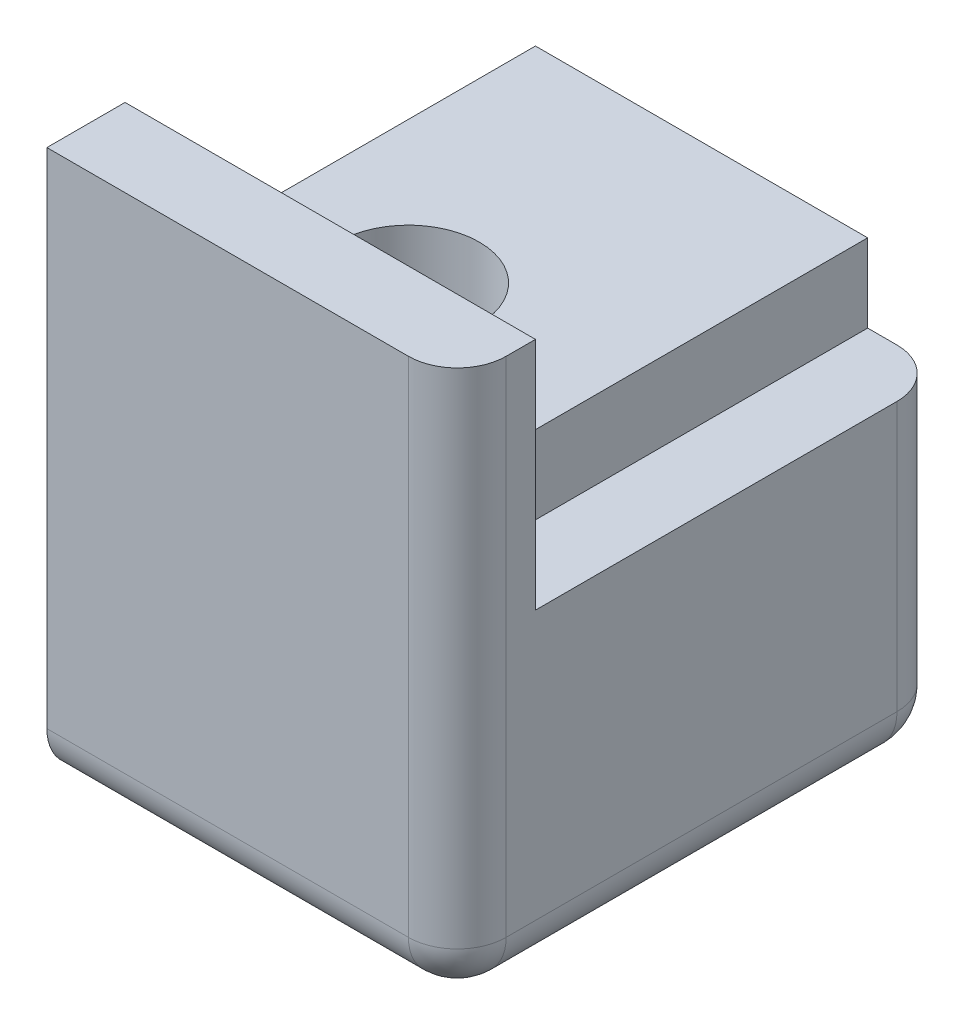
ISO-10303-21;
HEADER;
FILE_DESCRIPTION(('STEP AP214'),'2;1');
FILE_NAME('part.step','',(''),(''),'','','');
FILE_SCHEMA(('AUTOMOTIVE_DESIGN { 1 0 10303 214 1 1 1 1 }'));
ENDSEC;
DATA;
#1=APPLICATION_CONTEXT('core data for automotive mechanical design processes');
#2=APPLICATION_PROTOCOL_DEFINITION('international standard','automotive_design',2000,#1);
#3=PRODUCT_CONTEXT('',#1,'mechanical');
#4=PRODUCT('Part','Part','',(#3));
#5=PRODUCT_RELATED_PRODUCT_CATEGORY('part','',(#4));
#6=PRODUCT_DEFINITION_FORMATION('','',#4);
#7=PRODUCT_DEFINITION_CONTEXT('part definition',#1,'design');
#8=PRODUCT_DEFINITION('design','',#6,#7);
#9=PRODUCT_DEFINITION_SHAPE('','',#8);
#10=(LENGTH_UNIT() NAMED_UNIT(*) SI_UNIT(.MILLI.,.METRE.));
#11=(NAMED_UNIT(*) PLANE_ANGLE_UNIT() SI_UNIT($,.RADIAN.));
#12=(NAMED_UNIT(*) SI_UNIT($,.STERADIAN.) SOLID_ANGLE_UNIT());
#13=UNCERTAINTY_MEASURE_WITH_UNIT(LENGTH_MEASURE(1.E-05),#10,'distance_accuracy_value','');
#14=(GEOMETRIC_REPRESENTATION_CONTEXT(3) GLOBAL_UNCERTAINTY_ASSIGNED_CONTEXT((#13)) GLOBAL_UNIT_ASSIGNED_CONTEXT((#10,
#11,#12)) REPRESENTATION_CONTEXT('',''));
#15=CARTESIAN_POINT('',(0.,0.,0.));
#16=DIRECTION('',(0.,0.,1.));
#17=DIRECTION('',(1.,0.,0.));
#18=AXIS2_PLACEMENT_3D('',#15,#16,#17);
#19=CARTESIAN_POINT('',(-7.1,11.3,3.4));
#20=DIRECTION('',(0.,0.,1.));
#21=DIRECTION('',(0.,-1.,0.));
#22=AXIS2_PLACEMENT_3D('',#19,#20,#21);
#23=PLANE('',#22);
#24=DIRECTION('',(0.,1.,0.));
#25=VECTOR('',#24,1.);
#26=CARTESIAN_POINT('',(2.6,9.8,3.4));
#27=LINE('',#26,#25);
#28=CARTESIAN_POINT('',(2.6,6.5,3.4));
#29=VERTEX_POINT('',#28);
#30=CARTESIAN_POINT('',(2.6,8.1,3.4));
#31=VERTEX_POINT('',#30);
#32=EDGE_CURVE('E151',#29,#31,#27,.T.);
#33=ORIENTED_EDGE('',*,*,#32,.T.);
#34=DIRECTION('',(1.,0.,0.));
#35=VECTOR('',#34,1.);
#36=CARTESIAN_POINT('',(-4.2,8.1,3.4));
#37=LINE('',#36,#35);
#38=CARTESIAN_POINT('',(-4.2,8.1,3.4));
#39=VERTEX_POINT('',#38);
#40=EDGE_CURVE('E129',#39,#31,#37,.T.);
#41=ORIENTED_EDGE('',*,*,#40,.F.);
#42=DIRECTION('',(0.,-1.,0.));
#43=VECTOR('',#42,1.);
#44=CARTESIAN_POINT('',(-4.20000000000001,11.3,3.4));
#45=LINE('',#44,#43);
#46=CARTESIAN_POINT('',(-4.20000000000001,11.3,3.4));
#47=VERTEX_POINT('',#46);
#48=EDGE_CURVE('E139',#47,#39,#45,.T.);
#49=ORIENTED_EDGE('',*,*,#48,.F.);
#50=DIRECTION('',(-1.,0.,0.));
#51=VECTOR('',#50,1.);
#52=CARTESIAN_POINT('',(0.,11.3,3.4));
#53=LINE('',#52,#51);
#54=CARTESIAN_POINT('',(4.2,11.3,3.4));
#55=VERTEX_POINT('',#54);
#56=EDGE_CURVE('E190',#55,#47,#53,.T.);
#57=ORIENTED_EDGE('',*,*,#56,.F.);
#58=DIRECTION('',(0.,-1.,0.));
#59=VECTOR('',#58,1.);
#60=CARTESIAN_POINT('',(4.2,11.3,3.4));
#61=LINE('',#60,#59);
#62=CARTESIAN_POINT('',(4.2,6.5,3.4));
#63=VERTEX_POINT('',#62);
#64=EDGE_CURVE('E147',#55,#63,#61,.T.);
#65=ORIENTED_EDGE('',*,*,#64,.T.);
#66=DIRECTION('',(-1.,0.,0.));
#67=VECTOR('',#66,1.);
#68=CARTESIAN_POINT('',(4.2,6.5,3.4));
#69=LINE('',#68,#67);
#70=EDGE_CURVE('E164',#63,#29,#69,.T.);
#71=ORIENTED_EDGE('',*,*,#70,.T.);
#72=EDGE_LOOP('',(#33,#41,#49,#57,#65,#71));
#73=FACE_BOUND('',#72,.T.);
#74=ADVANCED_FACE('F35',(#73),#23,.F.);
#75=CARTESIAN_POINT('',(-4.2,8.1,3.4));
#76=DIRECTION('',(0.,-1.,0.));
#77=DIRECTION('',(1.,0.,0.));
#78=AXIS2_PLACEMENT_3D('',#75,#76,#77);
#79=PLANE('',#78);
#80=DIRECTION('',(0.,0.,-1.));
#81=VECTOR('',#80,1.);
#82=CARTESIAN_POINT('',(-4.2,8.1,3.4));
#83=LINE('',#82,#81);
#84=CARTESIAN_POINT('',(-4.2,8.1,-5.));
#85=VERTEX_POINT('',#84);
#86=EDGE_CURVE('E124',#39,#85,#83,.T.);
#87=ORIENTED_EDGE('',*,*,#86,.F.);
#88=ORIENTED_EDGE('',*,*,#40,.T.);
#89=DIRECTION('',(0.,0.,-1.));
#90=VECTOR('',#89,1.);
#91=CARTESIAN_POINT('',(2.6,8.1,3.4));
#92=LINE('',#91,#90);
#93=CARTESIAN_POINT('',(2.6,8.1,-5.));
#94=VERTEX_POINT('',#93);
#95=EDGE_CURVE('E136',#31,#94,#92,.T.);
#96=ORIENTED_EDGE('',*,*,#95,.T.);
#97=DIRECTION('',(1.,0.,0.));
#98=VECTOR('',#97,1.);
#99=CARTESIAN_POINT('',(-4.2,8.1,-5.));
#100=LINE('',#99,#98);
#101=EDGE_CURVE('E132',#85,#94,#100,.T.);
#102=ORIENTED_EDGE('',*,*,#101,.F.);
#103=EDGE_LOOP('',(#87,#88,#96,#102));
#104=FACE_BOUND('',#103,.T.);
#105=CARTESIAN_POINT('',(-1.30000000000001,8.1,0.499999999999998));
#106=DIRECTION('',(0.,-1.,0.));
#107=DIRECTION('',(1.,0.,0.));
#108=AXIS2_PLACEMENT_3D('',#105,#106,#107);
#109=CIRCLE('',#108,1.44999999999999);
#110=CARTESIAN_POINT('',(0.149999999999987,8.1,0.499999999999998));
#111=VERTEX_POINT('',#110);
#112=EDGE_CURVE('E155',#111,#111,#109,.T.);
#113=ORIENTED_EDGE('',*,*,#112,.T.);
#114=EDGE_LOOP('',(#113));
#115=FACE_BOUND('',#114,.T.);
#116=ADVANCED_FACE('F126',(#104,#115),#79,.F.);
#117=CARTESIAN_POINT('',(4.2,11.3,5.));
#118=DIRECTION('',(-1.,0.,0.));
#119=DIRECTION('',(0.,0.,1.));
#120=AXIS2_PLACEMENT_3D('',#117,#118,#119);
#121=PLANE('',#120);
#122=DIRECTION('',(0.,0.,-1.));
#123=VECTOR('',#122,1.);
#124=CARTESIAN_POINT('',(4.2,11.3,5.));
#125=LINE('',#124,#123);
#126=CARTESIAN_POINT('',(4.2,11.3,4.));
#127=VERTEX_POINT('',#126);
#128=EDGE_CURVE('E177',#127,#55,#125,.T.);
#129=ORIENTED_EDGE('',*,*,#128,.F.);
#130=DIRECTION('',(0.,-1.,0.));
#131=VECTOR('',#130,1.);
#132=CARTESIAN_POINT('',(4.2,11.3,4.));
#133=LINE('',#132,#131);
#134=CARTESIAN_POINT('',(4.2,1.,4.));
#135=VERTEX_POINT('',#134);
#136=EDGE_CURVE('E211',#127,#135,#133,.T.);
#137=ORIENTED_EDGE('',*,*,#136,.T.);
#138=DIRECTION('',(0.,0.,-1.));
#139=VECTOR('',#138,1.);
#140=CARTESIAN_POINT('',(4.2,1.,-5.));
#141=LINE('',#140,#139);
#142=CARTESIAN_POINT('',(4.2,1.,-4.));
#143=VERTEX_POINT('',#142);
#144=EDGE_CURVE('E207',#135,#143,#141,.T.);
#145=ORIENTED_EDGE('',*,*,#144,.T.);
#146=DIRECTION('',(0.,-1.,0.));
#147=VECTOR('',#146,1.);
#148=CARTESIAN_POINT('',(4.2,11.3,-4.));
#149=LINE('',#148,#147);
#150=CARTESIAN_POINT('',(4.2,6.5,-4.));
#151=VERTEX_POINT('',#150);
#152=EDGE_CURVE('E209',#143,#151,#149,.F.);
#153=ORIENTED_EDGE('',*,*,#152,.T.);
#154=DIRECTION('',(0.,0.,-1.));
#155=VECTOR('',#154,1.);
#156=CARTESIAN_POINT('',(4.2,6.5,3.4));
#157=LINE('',#156,#155);
#158=EDGE_CURVE('E168',#63,#151,#157,.T.);
#159=ORIENTED_EDGE('',*,*,#158,.F.);
#160=ORIENTED_EDGE('',*,*,#64,.F.);
#161=EDGE_LOOP('',(#129,#137,#145,#153,#159,#160));
#162=FACE_BOUND('',#161,.T.);
#163=ADVANCED_FACE('F269',(#162),#121,.F.);
#164=CARTESIAN_POINT('',(-4.20000000000001,11.3,-5.));
#165=DIRECTION('',(0.,0.,1.));
#166=DIRECTION('',(1.,0.,0.));
#167=AXIS2_PLACEMENT_3D('',#164,#165,#166);
#168=PLANE('',#167);
#169=DIRECTION('',(-1.,0.,0.));
#170=VECTOR('',#169,1.);
#171=CARTESIAN_POINT('',(4.2,6.5,-5.));
#172=LINE('',#171,#170);
#173=CARTESIAN_POINT('',(3.2,6.5,-5.));
#174=VERTEX_POINT('',#173);
#175=CARTESIAN_POINT('',(2.6,6.5,-5.));
#176=VERTEX_POINT('',#175);
#177=EDGE_CURVE('E163',#174,#176,#172,.T.);
#178=ORIENTED_EDGE('',*,*,#177,.F.);
#179=DIRECTION('',(0.,-1.,0.));
#180=VECTOR('',#179,1.);
#181=CARTESIAN_POINT('',(3.2,11.3,-5.));
#182=LINE('',#181,#180);
#183=CARTESIAN_POINT('',(3.2,1.,-5.));
#184=VERTEX_POINT('',#183);
#185=EDGE_CURVE('E44',#174,#184,#182,.T.);
#186=ORIENTED_EDGE('',*,*,#185,.T.);
#187=DIRECTION('',(-1.,0.,0.));
#188=VECTOR('',#187,1.);
#189=CARTESIAN_POINT('',(-4.20000000000001,1.,-5.));
#190=LINE('',#189,#188);
#191=CARTESIAN_POINT('',(-4.20000000000001,1.,-5.));
#192=VERTEX_POINT('',#191);
#193=EDGE_CURVE('E215',#184,#192,#190,.T.);
#194=ORIENTED_EDGE('',*,*,#193,.T.);
#195=DIRECTION('',(0.,-1.,0.));
#196=VECTOR('',#195,1.);
#197=CARTESIAN_POINT('',(-4.20000000000001,11.3,-5.));
#198=LINE('',#197,#196);
#199=EDGE_CURVE('E188',#85,#192,#198,.T.);
#200=ORIENTED_EDGE('',*,*,#199,.F.);
#201=ORIENTED_EDGE('',*,*,#101,.T.);
#202=DIRECTION('',(0.,1.,0.));
#203=VECTOR('',#202,1.);
#204=CARTESIAN_POINT('',(2.6,9.8,-5.));
#205=LINE('',#204,#203);
#206=EDGE_CURVE('E166',#176,#94,#205,.T.);
#207=ORIENTED_EDGE('',*,*,#206,.F.);
#208=EDGE_LOOP('',(#178,#186,#194,#200,#201,#207));
#209=FACE_BOUND('',#208,.T.);
#210=ADVANCED_FACE('F251',(#209),#168,.F.);
#211=CARTESIAN_POINT('',(-4.20000000000001,11.3,5.));
#212=DIRECTION('',(1.,0.,0.));
#213=DIRECTION('',(0.,0.,-1.));
#214=AXIS2_PLACEMENT_3D('',#211,#212,#213);
#215=PLANE('',#214);
#216=ORIENTED_EDGE('',*,*,#48,.T.);
#217=ORIENTED_EDGE('',*,*,#86,.T.);
#218=ORIENTED_EDGE('',*,*,#199,.T.);
#219=CARTESIAN_POINT('',(-4.20000000000001,1.,-4.));
#220=DIRECTION('',(1.,0.,0.));
#221=DIRECTION('',(0.,0.,-1.));
#222=AXIS2_PLACEMENT_3D('',#219,#220,#221);
#223=CIRCLE('',#222,1.);
#224=CARTESIAN_POINT('',(-4.20000000000001,0.,-4.));
#225=VERTEX_POINT('',#224);
#226=EDGE_CURVE('E203',#192,#225,#223,.F.);
#227=ORIENTED_EDGE('',*,*,#226,.T.);
#228=DIRECTION('',(0.,0.,1.));
#229=VECTOR('',#228,1.);
#230=CARTESIAN_POINT('',(-4.20000000000001,0.,5.));
#231=LINE('',#230,#229);
#232=CARTESIAN_POINT('',(-4.20000000000001,0.,4.));
#233=VERTEX_POINT('',#232);
#234=EDGE_CURVE('E146',#225,#233,#231,.T.);
#235=ORIENTED_EDGE('',*,*,#234,.T.);
#236=CARTESIAN_POINT('',(-4.20000000000001,1.,4.));
#237=DIRECTION('',(1.,0.,0.));
#238=DIRECTION('',(0.,0.,-1.));
#239=AXIS2_PLACEMENT_3D('',#236,#237,#238);
#240=CIRCLE('',#239,1.);
#241=CARTESIAN_POINT('',(-4.20000000000001,1.,5.));
#242=VERTEX_POINT('',#241);
#243=EDGE_CURVE('E205',#233,#242,#240,.F.);
#244=ORIENTED_EDGE('',*,*,#243,.T.);
#245=DIRECTION('',(0.,-1.,0.));
#246=VECTOR('',#245,1.);
#247=CARTESIAN_POINT('',(-4.20000000000001,11.3,5.));
#248=LINE('',#247,#246);
#249=CARTESIAN_POINT('',(-4.20000000000001,11.3,5.));
#250=VERTEX_POINT('',#249);
#251=EDGE_CURVE('E183',#250,#242,#248,.T.);
#252=ORIENTED_EDGE('',*,*,#251,.F.);
#253=DIRECTION('',(0.,0.,1.));
#254=VECTOR('',#253,1.);
#255=CARTESIAN_POINT('',(-4.20000000000001,11.3,5.));
#256=LINE('',#255,#254);
#257=EDGE_CURVE('E142',#47,#250,#256,.T.);
#258=ORIENTED_EDGE('',*,*,#257,.F.);
#259=EDGE_LOOP('',(#216,#217,#218,#227,#235,#244,#252,#258));
#260=FACE_BOUND('',#259,.T.);
#261=ADVANCED_FACE('F140',(#260),#215,.F.);
#262=CARTESIAN_POINT('',(-4.20000000000001,11.3,5.));
#263=DIRECTION('',(0.,0.,-1.));
#264=DIRECTION('',(-1.,0.,0.));
#265=AXIS2_PLACEMENT_3D('',#262,#263,#264);
#266=PLANE('',#265);
#267=ORIENTED_EDGE('',*,*,#251,.T.);
#268=DIRECTION('',(1.,0.,0.));
#269=VECTOR('',#268,1.);
#270=CARTESIAN_POINT('',(4.2,1.,5.));
#271=LINE('',#270,#269);
#272=CARTESIAN_POINT('',(3.2,1.,5.));
#273=VERTEX_POINT('',#272);
#274=EDGE_CURVE('E194',#242,#273,#271,.T.);
#275=ORIENTED_EDGE('',*,*,#274,.T.);
#276=DIRECTION('',(0.,-1.,0.));
#277=VECTOR('',#276,1.);
#278=CARTESIAN_POINT('',(3.2,11.3,5.));
#279=LINE('',#278,#277);
#280=CARTESIAN_POINT('',(3.2,11.3,5.));
#281=VERTEX_POINT('',#280);
#282=EDGE_CURVE('E192',#273,#281,#279,.F.);
#283=ORIENTED_EDGE('',*,*,#282,.T.);
#284=DIRECTION('',(1.,0.,0.));
#285=VECTOR('',#284,1.);
#286=CARTESIAN_POINT('',(-4.20000000000001,11.3,5.));
#287=LINE('',#286,#285);
#288=EDGE_CURVE('E180',#250,#281,#287,.T.);
#289=ORIENTED_EDGE('',*,*,#288,.F.);
#290=EDGE_LOOP('',(#267,#275,#283,#289));
#291=FACE_BOUND('',#290,.T.);
#292=ADVANCED_FACE('F258',(#291),#266,.F.);
#293=CARTESIAN_POINT('',(0.,11.3,0.));
#294=DIRECTION('',(0.,-1.,0.));
#295=DIRECTION('',(0.,0.,-1.));
#296=AXIS2_PLACEMENT_3D('',#293,#294,#295);
#297=PLANE('',#296);
#298=ORIENTED_EDGE('',*,*,#288,.T.);
#299=CARTESIAN_POINT('',(3.2,11.3,4.));
#300=DIRECTION('',(0.,-1.,0.));
#301=DIRECTION('',(0.,0.,-1.));
#302=AXIS2_PLACEMENT_3D('',#299,#300,#301);
#303=CIRCLE('',#302,1.);
#304=EDGE_CURVE('E213',#281,#127,#303,.F.);
#305=ORIENTED_EDGE('',*,*,#304,.T.);
#306=ORIENTED_EDGE('',*,*,#128,.T.);
#307=ORIENTED_EDGE('',*,*,#56,.T.);
#308=ORIENTED_EDGE('',*,*,#257,.T.);
#309=EDGE_LOOP('',(#298,#305,#306,#307,#308));
#310=FACE_BOUND('',#309,.T.);
#311=ADVANCED_FACE('F263',(#310),#297,.F.);
#312=CARTESIAN_POINT('',(0.,0.,0.));
#313=DIRECTION('',(0.,-1.,0.));
#314=DIRECTION('',(0.,0.,-1.));
#315=AXIS2_PLACEMENT_3D('',#312,#313,#314);
#316=PLANE('',#315);
#317=CARTESIAN_POINT('',(-1.30000000000001,0.,0.499999999999998));
#318=DIRECTION('',(0.,-1.,0.));
#319=DIRECTION('',(0.,0.,-1.));
#320=AXIS2_PLACEMENT_3D('',#317,#318,#319);
#321=CIRCLE('',#320,1.44999999999999);
#322=CARTESIAN_POINT('',(-1.30000000000001,0.,-0.94999999999999));
#323=VERTEX_POINT('',#322);
#324=EDGE_CURVE('E152',#323,#323,#321,.T.);
#325=ORIENTED_EDGE('',*,*,#324,.F.);
#326=EDGE_LOOP('',(#325));
#327=FACE_BOUND('',#326,.T.);
#328=DIRECTION('',(0.,0.,-1.));
#329=VECTOR('',#328,1.);
#330=CARTESIAN_POINT('',(3.2,0.,5.));
#331=LINE('',#330,#329);
#332=CARTESIAN_POINT('',(3.2,0.,-4.));
#333=VERTEX_POINT('',#332);
#334=CARTESIAN_POINT('',(3.2,0.,4.));
#335=VERTEX_POINT('',#334);
#336=EDGE_CURVE('E197',#333,#335,#331,.F.);
#337=ORIENTED_EDGE('',*,*,#336,.T.);
#338=DIRECTION('',(1.,0.,0.));
#339=VECTOR('',#338,1.);
#340=CARTESIAN_POINT('',(-4.20000000000001,0.,4.));
#341=LINE('',#340,#339);
#342=EDGE_CURVE('E201',#335,#233,#341,.F.);
#343=ORIENTED_EDGE('',*,*,#342,.T.);
#344=ORIENTED_EDGE('',*,*,#234,.F.);
#345=DIRECTION('',(-1.,0.,0.));
#346=VECTOR('',#345,1.);
#347=CARTESIAN_POINT('',(4.2,0.,-4.));
#348=LINE('',#347,#346);
#349=EDGE_CURVE('E199',#225,#333,#348,.F.);
#350=ORIENTED_EDGE('',*,*,#349,.T.);
#351=EDGE_LOOP('',(#337,#343,#344,#350));
#352=FACE_BOUND('',#351,.T.);
#353=ADVANCED_FACE('F245',(#327,#352),#316,.T.);
#354=CARTESIAN_POINT('',(2.6,9.8,3.4));
#355=DIRECTION('',(-1.,0.,0.));
#356=DIRECTION('',(0.,-1.,0.));
#357=AXIS2_PLACEMENT_3D('',#354,#355,#356);
#358=PLANE('',#357);
#359=ORIENTED_EDGE('',*,*,#95,.F.);
#360=ORIENTED_EDGE('',*,*,#32,.F.);
#361=DIRECTION('',(0.,0.,-1.));
#362=VECTOR('',#361,1.);
#363=CARTESIAN_POINT('',(2.6,6.5,3.4));
#364=LINE('',#363,#362);
#365=EDGE_CURVE('E172',#29,#176,#364,.T.);
#366=ORIENTED_EDGE('',*,*,#365,.T.);
#367=ORIENTED_EDGE('',*,*,#206,.T.);
#368=EDGE_LOOP('',(#359,#360,#366,#367));
#369=FACE_BOUND('',#368,.T.);
#370=ADVANCED_FACE('F279',(#369),#358,.F.);
#371=CARTESIAN_POINT('',(4.2,6.5,3.4));
#372=DIRECTION('',(0.,-1.,0.));
#373=DIRECTION('',(0.,0.,-1.));
#374=AXIS2_PLACEMENT_3D('',#371,#372,#373);
#375=PLANE('',#374);
#376=ORIENTED_EDGE('',*,*,#158,.T.);
#377=CARTESIAN_POINT('',(3.2,6.5,-4.));
#378=DIRECTION('',(0.,-1.,0.));
#379=DIRECTION('',(0.,0.,-1.));
#380=AXIS2_PLACEMENT_3D('',#377,#378,#379);
#381=CIRCLE('',#380,1.);
#382=EDGE_CURVE('E11',#151,#174,#381,.F.);
#383=ORIENTED_EDGE('',*,*,#382,.T.);
#384=ORIENTED_EDGE('',*,*,#177,.T.);
#385=ORIENTED_EDGE('',*,*,#365,.F.);
#386=ORIENTED_EDGE('',*,*,#70,.F.);
#387=EDGE_LOOP('',(#376,#383,#384,#385,#386));
#388=FACE_BOUND('',#387,.T.);
#389=ADVANCED_FACE('F273',(#388),#375,.F.);
#390=CARTESIAN_POINT('',(3.2,11.3,-4.));
#391=DIRECTION('',(0.,-1.,0.));
#392=DIRECTION('',(0.,0.,-1.));
#393=AXIS2_PLACEMENT_3D('',#390,#391,#392);
#394=CYLINDRICAL_SURFACE('',#393,1.);
#395=ORIENTED_EDGE('',*,*,#382,.F.);
#396=ORIENTED_EDGE('',*,*,#152,.F.);
#397=CARTESIAN_POINT('',(3.2,1.,-4.));
#398=DIRECTION('',(0.,-1.,0.));
#399=DIRECTION('',(0.,0.,-1.));
#400=AXIS2_PLACEMENT_3D('',#397,#398,#399);
#401=CIRCLE('',#400,1.);
#402=EDGE_CURVE('E39',#184,#143,#401,.T.);
#403=ORIENTED_EDGE('',*,*,#402,.F.);
#404=ORIENTED_EDGE('',*,*,#185,.F.);
#405=EDGE_LOOP('',(#395,#396,#403,#404));
#406=FACE_BOUND('',#405,.T.);
#407=ADVANCED_FACE('F37',(#406),#394,.T.);
#408=CARTESIAN_POINT('',(-4.20000000000001,1.,-4.));
#409=DIRECTION('',(1.,0.,0.));
#410=DIRECTION('',(0.,0.,-1.));
#411=AXIS2_PLACEMENT_3D('',#408,#409,#410);
#412=CYLINDRICAL_SURFACE('',#411,1.);
#413=ORIENTED_EDGE('',*,*,#226,.F.);
#414=ORIENTED_EDGE('',*,*,#193,.F.);
#415=CARTESIAN_POINT('',(3.2,1.,-4.));
#416=DIRECTION('',(1.,0.,0.));
#417=DIRECTION('',(0.,0.,-1.));
#418=AXIS2_PLACEMENT_3D('',#415,#416,#417);
#419=CIRCLE('',#418,1.);
#420=EDGE_CURVE('E227',#333,#184,#419,.T.);
#421=ORIENTED_EDGE('',*,*,#420,.F.);
#422=ORIENTED_EDGE('',*,*,#349,.F.);
#423=EDGE_LOOP('',(#413,#414,#421,#422));
#424=FACE_BOUND('',#423,.T.);
#425=ADVANCED_FACE('F250',(#424),#412,.T.);
#426=CARTESIAN_POINT('',(3.2,1.,-4.));
#427=DIRECTION('',(0.,0.,1.));
#428=DIRECTION('',(1.,0.,0.));
#429=AXIS2_PLACEMENT_3D('',#426,#427,#428);
#430=SPHERICAL_SURFACE('',#429,1.);
#431=ORIENTED_EDGE('',*,*,#420,.T.);
#432=ORIENTED_EDGE('',*,*,#402,.T.);
#433=CARTESIAN_POINT('',(3.2,1.,-4.));
#434=DIRECTION('',(0.,0.,-1.));
#435=DIRECTION('',(-1.,0.,0.));
#436=AXIS2_PLACEMENT_3D('',#433,#434,#435);
#437=CIRCLE('',#436,1.);
#438=EDGE_CURVE('E225',#333,#143,#437,.F.);
#439=ORIENTED_EDGE('',*,*,#438,.F.);
#440=EDGE_LOOP('',(#431,#432,#439));
#441=FACE_BOUND('',#440,.T.);
#442=ADVANCED_FACE('F234',(#441),#430,.T.);
#443=CARTESIAN_POINT('',(3.2,11.3,4.));
#444=DIRECTION('',(0.,-1.,0.));
#445=DIRECTION('',(0.,0.,-1.));
#446=AXIS2_PLACEMENT_3D('',#443,#444,#445);
#447=CYLINDRICAL_SURFACE('',#446,1.);
#448=ORIENTED_EDGE('',*,*,#304,.F.);
#449=ORIENTED_EDGE('',*,*,#282,.F.);
#450=CARTESIAN_POINT('',(3.2,1.,4.));
#451=DIRECTION('',(0.,-1.,0.));
#452=DIRECTION('',(0.,0.,-1.));
#453=AXIS2_PLACEMENT_3D('',#450,#451,#452);
#454=CIRCLE('',#453,1.);
#455=EDGE_CURVE('E222',#135,#273,#454,.T.);
#456=ORIENTED_EDGE('',*,*,#455,.F.);
#457=ORIENTED_EDGE('',*,*,#136,.F.);
#458=EDGE_LOOP('',(#448,#449,#456,#457));
#459=FACE_BOUND('',#458,.T.);
#460=ADVANCED_FACE('F267',(#459),#447,.T.);
#461=CARTESIAN_POINT('',(3.2,1.,5.));
#462=DIRECTION('',(0.,0.,1.));
#463=DIRECTION('',(1.,0.,0.));
#464=AXIS2_PLACEMENT_3D('',#461,#462,#463);
#465=CYLINDRICAL_SURFACE('',#464,1.);
#466=ORIENTED_EDGE('',*,*,#438,.T.);
#467=ORIENTED_EDGE('',*,*,#144,.F.);
#468=CARTESIAN_POINT('',(3.2,1.,4.));
#469=DIRECTION('',(0.,0.,1.));
#470=DIRECTION('',(1.,0.,0.));
#471=AXIS2_PLACEMENT_3D('',#468,#469,#470);
#472=CIRCLE('',#471,1.);
#473=EDGE_CURVE('E219',#335,#135,#472,.T.);
#474=ORIENTED_EDGE('',*,*,#473,.F.);
#475=ORIENTED_EDGE('',*,*,#336,.F.);
#476=EDGE_LOOP('',(#466,#467,#474,#475));
#477=FACE_BOUND('',#476,.T.);
#478=ADVANCED_FACE('F240',(#477),#465,.T.);
#479=CARTESIAN_POINT('',(3.2,1.,4.));
#480=DIRECTION('',(0.,0.,1.));
#481=DIRECTION('',(1.,0.,0.));
#482=AXIS2_PLACEMENT_3D('',#479,#480,#481);
#483=SPHERICAL_SURFACE('',#482,1.);
#484=ORIENTED_EDGE('',*,*,#473,.T.);
#485=ORIENTED_EDGE('',*,*,#455,.T.);
#486=CARTESIAN_POINT('',(3.2,1.,4.));
#487=DIRECTION('',(1.,0.,0.));
#488=DIRECTION('',(0.,0.,-1.));
#489=AXIS2_PLACEMENT_3D('',#486,#487,#488);
#490=CIRCLE('',#489,1.);
#491=EDGE_CURVE('E159',#335,#273,#490,.F.);
#492=ORIENTED_EDGE('',*,*,#491,.F.);
#493=EDGE_LOOP('',(#484,#485,#492));
#494=FACE_BOUND('',#493,.T.);
#495=ADVANCED_FACE('F305',(#494),#483,.T.);
#496=CARTESIAN_POINT('',(-4.20000000000001,1.,4.));
#497=DIRECTION('',(-1.,0.,0.));
#498=DIRECTION('',(0.,0.,1.));
#499=AXIS2_PLACEMENT_3D('',#496,#497,#498);
#500=CYLINDRICAL_SURFACE('',#499,1.);
#501=ORIENTED_EDGE('',*,*,#243,.F.);
#502=ORIENTED_EDGE('',*,*,#342,.F.);
#503=ORIENTED_EDGE('',*,*,#491,.T.);
#504=ORIENTED_EDGE('',*,*,#274,.F.);
#505=EDGE_LOOP('',(#501,#502,#503,#504));
#506=FACE_BOUND('',#505,.T.);
#507=ADVANCED_FACE('F255',(#506),#500,.T.);
#508=CARTESIAN_POINT('',(-1.30000000000001,0.,0.499999999999998));
#509=DIRECTION('',(0.,-1.,0.));
#510=DIRECTION('',(0.,0.,-1.));
#511=AXIS2_PLACEMENT_3D('',#508,#509,#510);
#512=CYLINDRICAL_SURFACE('',#511,1.44999999999999);
#513=ORIENTED_EDGE('',*,*,#324,.T.);
#514=EDGE_LOOP('',(#513));
#515=FACE_BOUND('',#514,.T.);
#516=ORIENTED_EDGE('',*,*,#112,.F.);
#517=EDGE_LOOP('',(#516));
#518=FACE_BOUND('',#517,.T.);
#519=ADVANCED_FACE('F304',(#515,#518),#512,.F.);
#520=CLOSED_SHELL('',(#74,#116,#163,#210,#261,#292,#311,#353,#370,#389,#407,#425,#442,#460,#478,
#495,#507,#519));
#521=MANIFOLD_SOLID_BREP('B2',#520);
#522=ADVANCED_BREP_SHAPE_REPRESENTATION('',(#18,#521),#14);
#523=SHAPE_DEFINITION_REPRESENTATION(#9,#522);
ENDSEC;
END-ISO-10303-21;
